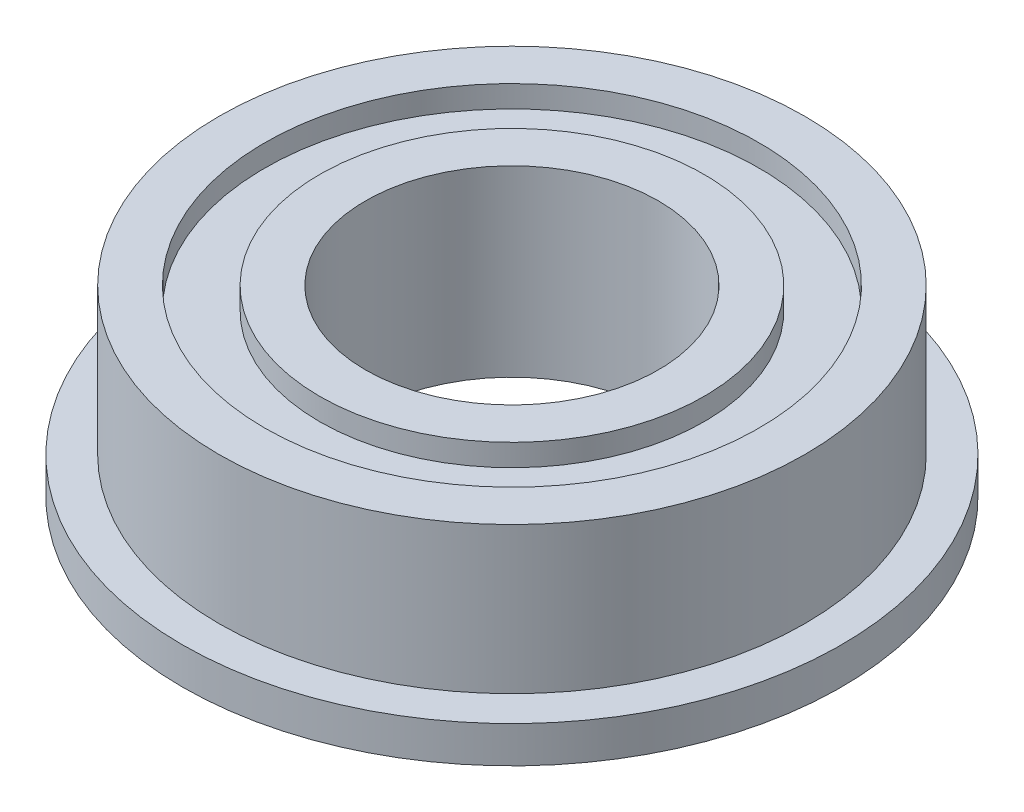
ISO-10303-21;
HEADER;
FILE_DESCRIPTION(('STEP AP214'),'2;1');
FILE_NAME('part.step','',(''),(''),'','','');
FILE_SCHEMA(('AUTOMOTIVE_DESIGN { 1 0 10303 214 1 1 1 1 }'));
ENDSEC;
DATA;
#1=APPLICATION_CONTEXT('core data for automotive mechanical design processes');
#2=APPLICATION_PROTOCOL_DEFINITION('international standard','automotive_design',2000,#1);
#3=PRODUCT_CONTEXT('',#1,'mechanical');
#4=PRODUCT('Part','Part','',(#3));
#5=PRODUCT_RELATED_PRODUCT_CATEGORY('part','',(#4));
#6=PRODUCT_DEFINITION_FORMATION('','',#4);
#7=PRODUCT_DEFINITION_CONTEXT('part definition',#1,'design');
#8=PRODUCT_DEFINITION('design','',#6,#7);
#9=PRODUCT_DEFINITION_SHAPE('','',#8);
#10=(LENGTH_UNIT() NAMED_UNIT(*) SI_UNIT(.MILLI.,.METRE.));
#11=(NAMED_UNIT(*) PLANE_ANGLE_UNIT() SI_UNIT($,.RADIAN.));
#12=(NAMED_UNIT(*) SI_UNIT($,.STERADIAN.) SOLID_ANGLE_UNIT());
#13=UNCERTAINTY_MEASURE_WITH_UNIT(LENGTH_MEASURE(1.E-05),#10,'distance_accuracy_value','');
#14=(GEOMETRIC_REPRESENTATION_CONTEXT(3) GLOBAL_UNCERTAINTY_ASSIGNED_CONTEXT((#13)) GLOBAL_UNIT_ASSIGNED_CONTEXT((#10,
#11,#12)) REPRESENTATION_CONTEXT('',''));
#15=CARTESIAN_POINT('',(0.,0.,0.));
#16=DIRECTION('',(0.,0.,1.));
#17=DIRECTION('',(1.,0.,0.));
#18=AXIS2_PLACEMENT_3D('',#15,#16,#17);
#19=CARTESIAN_POINT('',(0.,0.,0.));
#20=DIRECTION('',(0.,1.,0.));
#21=DIRECTION('',(0.,0.,1.));
#22=AXIS2_PLACEMENT_3D('',#19,#20,#21);
#23=PLANE('',#22);
#24=CARTESIAN_POINT('',(0.,0.,0.));
#25=DIRECTION('',(0.,1.,0.));
#26=DIRECTION('',(0.,0.,1.));
#27=AXIS2_PLACEMENT_3D('',#24,#25,#26);
#28=CIRCLE('',#27,4.);
#29=CARTESIAN_POINT('',(0.,0.,4.));
#30=VERTEX_POINT('',#29);
#31=EDGE_CURVE('E48',#30,#30,#28,.T.);
#32=ORIENTED_EDGE('',*,*,#31,.T.);
#33=EDGE_LOOP('',(#32));
#34=FACE_BOUND('',#33,.T.);
#35=CARTESIAN_POINT('',(0.,0.,0.));
#36=DIRECTION('',(0.,-1.,0.));
#37=DIRECTION('',(0.,0.,-1.));
#38=AXIS2_PLACEMENT_3D('',#35,#36,#37);
#39=CIRCLE('',#38,5.25);
#40=CARTESIAN_POINT('',(0.,0.,-5.25));
#41=VERTEX_POINT('',#40);
#42=EDGE_CURVE('E80',#41,#41,#39,.T.);
#43=ORIENTED_EDGE('',*,*,#42,.T.);
#44=EDGE_LOOP('',(#43));
#45=FACE_BOUND('',#44,.T.);
#46=ADVANCED_FACE('F31',(#34,#45),#23,.F.);
#47=CARTESIAN_POINT('',(0.,5.,0.));
#48=DIRECTION('',(0.,1.,0.));
#49=DIRECTION('',(0.,0.,1.));
#50=AXIS2_PLACEMENT_3D('',#47,#48,#49);
#51=PLANE('',#50);
#52=CARTESIAN_POINT('',(0.,5.,0.));
#53=DIRECTION('',(0.,1.,0.));
#54=DIRECTION('',(0.,0.,1.));
#55=AXIS2_PLACEMENT_3D('',#52,#53,#54);
#56=CIRCLE('',#55,4.);
#57=CARTESIAN_POINT('',(0.,5.,4.));
#58=VERTEX_POINT('',#57);
#59=EDGE_CURVE('E54',#58,#58,#56,.T.);
#60=ORIENTED_EDGE('',*,*,#59,.F.);
#61=EDGE_LOOP('',(#60));
#62=FACE_BOUND('',#61,.T.);
#63=CARTESIAN_POINT('',(0.,5.,0.));
#64=DIRECTION('',(0.,1.,0.));
#65=DIRECTION('',(0.,0.,1.));
#66=AXIS2_PLACEMENT_3D('',#63,#64,#65);
#67=CIRCLE('',#66,5.25);
#68=CARTESIAN_POINT('',(0.,5.,5.25));
#69=VERTEX_POINT('',#68);
#70=EDGE_CURVE('E68',#69,#69,#67,.T.);
#71=ORIENTED_EDGE('',*,*,#70,.T.);
#72=EDGE_LOOP('',(#71));
#73=FACE_BOUND('',#72,.T.);
#74=ADVANCED_FACE('F119',(#62,#73),#51,.T.);
#75=CARTESIAN_POINT('',(0.,1.,0.));
#76=DIRECTION('',(0.,1.,0.));
#77=DIRECTION('',(0.,0.,1.));
#78=AXIS2_PLACEMENT_3D('',#75,#76,#77);
#79=PLANE('',#78);
#80=CARTESIAN_POINT('',(0.,1.,0.));
#81=DIRECTION('',(0.,1.,0.));
#82=DIRECTION('',(0.,0.,1.));
#83=AXIS2_PLACEMENT_3D('',#80,#81,#82);
#84=CIRCLE('',#83,8.);
#85=CARTESIAN_POINT('',(0.,1.,8.));
#86=VERTEX_POINT('',#85);
#87=EDGE_CURVE('E10',#86,#86,#84,.T.);
#88=ORIENTED_EDGE('',*,*,#87,.F.);
#89=EDGE_LOOP('',(#88));
#90=FACE_BOUND('',#89,.T.);
#91=CARTESIAN_POINT('',(0.,1.,0.));
#92=DIRECTION('',(0.,1.,0.));
#93=DIRECTION('',(0.,0.,1.));
#94=AXIS2_PLACEMENT_3D('',#91,#92,#93);
#95=CIRCLE('',#94,9.);
#96=CARTESIAN_POINT('',(0.,1.,9.));
#97=VERTEX_POINT('',#96);
#98=EDGE_CURVE('E39',#97,#97,#95,.T.);
#99=ORIENTED_EDGE('',*,*,#98,.T.);
#100=EDGE_LOOP('',(#99));
#101=FACE_BOUND('',#100,.T.);
#102=ADVANCED_FACE('F105',(#90,#101),#79,.T.);
#103=CARTESIAN_POINT('',(0.,0.,0.));
#104=DIRECTION('',(0.,-1.,0.));
#105=DIRECTION('',(0.,0.,-1.));
#106=AXIS2_PLACEMENT_3D('',#103,#104,#105);
#107=CIRCLE('',#106,6.75);
#108=CARTESIAN_POINT('',(0.,0.,-6.75));
#109=VERTEX_POINT('',#108);
#110=EDGE_CURVE('E74',#109,#109,#107,.T.);
#111=ORIENTED_EDGE('',*,*,#110,.F.);
#112=EDGE_LOOP('',(#111));
#113=FACE_BOUND('',#112,.T.);
#114=CARTESIAN_POINT('',(0.,0.,0.));
#115=DIRECTION('',(0.,1.,0.));
#116=DIRECTION('',(0.,0.,1.));
#117=AXIS2_PLACEMENT_3D('',#114,#115,#116);
#118=CIRCLE('',#117,9.);
#119=CARTESIAN_POINT('',(0.,0.,9.));
#120=VERTEX_POINT('',#119);
#121=EDGE_CURVE('E35',#120,#120,#118,.T.);
#122=ORIENTED_EDGE('',*,*,#121,.F.);
#123=EDGE_LOOP('',(#122));
#124=FACE_BOUND('',#123,.T.);
#125=ADVANCED_FACE('F102',(#113,#124),#23,.F.);
#126=CARTESIAN_POINT('',(0.,1.,0.));
#127=DIRECTION('',(0.,-1.,0.));
#128=DIRECTION('',(0.,0.,-1.));
#129=AXIS2_PLACEMENT_3D('',#126,#127,#128);
#130=CYLINDRICAL_SURFACE('',#129,9.);
#131=ORIENTED_EDGE('',*,*,#98,.F.);
#132=EDGE_LOOP('',(#131));
#133=FACE_BOUND('',#132,.T.);
#134=ORIENTED_EDGE('',*,*,#121,.T.);
#135=EDGE_LOOP('',(#134));
#136=FACE_BOUND('',#135,.T.);
#137=ADVANCED_FACE('F33',(#133,#136),#130,.T.);
#138=CARTESIAN_POINT('',(0.,1.,0.));
#139=DIRECTION('',(0.,-1.,0.));
#140=DIRECTION('',(0.,0.,-1.));
#141=AXIS2_PLACEMENT_3D('',#138,#139,#140);
#142=CYLINDRICAL_SURFACE('',#141,4.);
#143=ORIENTED_EDGE('',*,*,#31,.F.);
#144=EDGE_LOOP('',(#143));
#145=FACE_BOUND('',#144,.T.);
#146=ORIENTED_EDGE('',*,*,#59,.T.);
#147=EDGE_LOOP('',(#146));
#148=FACE_BOUND('',#147,.T.);
#149=ADVANCED_FACE('F109',(#145,#148),#142,.F.);
#150=CARTESIAN_POINT('',(0.,5.,0.));
#151=DIRECTION('',(0.,1.,0.));
#152=DIRECTION('',(0.,0.,1.));
#153=AXIS2_PLACEMENT_3D('',#150,#151,#152);
#154=CIRCLE('',#153,6.75);
#155=CARTESIAN_POINT('',(0.,5.,6.75));
#156=VERTEX_POINT('',#155);
#157=EDGE_CURVE('E62',#156,#156,#154,.T.);
#158=ORIENTED_EDGE('',*,*,#157,.F.);
#159=EDGE_LOOP('',(#158));
#160=FACE_BOUND('',#159,.T.);
#161=CARTESIAN_POINT('',(0.,5.,0.));
#162=DIRECTION('',(0.,1.,0.));
#163=DIRECTION('',(0.,0.,1.));
#164=AXIS2_PLACEMENT_3D('',#161,#162,#163);
#165=CIRCLE('',#164,8.);
#166=CARTESIAN_POINT('',(0.,5.,8.));
#167=VERTEX_POINT('',#166);
#168=EDGE_CURVE('E46',#167,#167,#165,.T.);
#169=ORIENTED_EDGE('',*,*,#168,.T.);
#170=EDGE_LOOP('',(#169));
#171=FACE_BOUND('',#170,.T.);
#172=ADVANCED_FACE('F114',(#160,#171),#51,.T.);
#173=CARTESIAN_POINT('',(0.,5.,0.));
#174=DIRECTION('',(0.,-1.,0.));
#175=DIRECTION('',(0.,0.,-1.));
#176=AXIS2_PLACEMENT_3D('',#173,#174,#175);
#177=CYLINDRICAL_SURFACE('',#176,8.);
#178=ORIENTED_EDGE('',*,*,#168,.F.);
#179=EDGE_LOOP('',(#178));
#180=FACE_BOUND('',#179,.T.);
#181=ORIENTED_EDGE('',*,*,#87,.T.);
#182=EDGE_LOOP('',(#181));
#183=FACE_BOUND('',#182,.T.);
#184=ADVANCED_FACE('F130',(#180,#183),#177,.T.);
#185=CARTESIAN_POINT('',(0.,4.4,0.));
#186=DIRECTION('',(0.,1.,0.));
#187=DIRECTION('',(0.,0.,1.));
#188=AXIS2_PLACEMENT_3D('',#185,#186,#187);
#189=CYLINDRICAL_SURFACE('',#188,6.75);
#190=CARTESIAN_POINT('',(0.,4.4,0.));
#191=DIRECTION('',(0.,1.,0.));
#192=DIRECTION('',(0.,0.,1.));
#193=AXIS2_PLACEMENT_3D('',#190,#191,#192);
#194=CIRCLE('',#193,6.75);
#195=CARTESIAN_POINT('',(0.,4.4,6.75));
#196=VERTEX_POINT('',#195);
#197=EDGE_CURVE('E58',#196,#196,#194,.T.);
#198=ORIENTED_EDGE('',*,*,#197,.F.);
#199=EDGE_LOOP('',(#198));
#200=FACE_BOUND('',#199,.T.);
#201=ORIENTED_EDGE('',*,*,#157,.T.);
#202=EDGE_LOOP('',(#201));
#203=FACE_BOUND('',#202,.T.);
#204=ADVANCED_FACE('F132',(#200,#203),#189,.F.);
#205=CARTESIAN_POINT('',(0.,4.4,0.));
#206=DIRECTION('',(0.,1.,0.));
#207=DIRECTION('',(0.,0.,1.));
#208=AXIS2_PLACEMENT_3D('',#205,#206,#207);
#209=PLANE('',#208);
#210=CARTESIAN_POINT('',(0.,4.4,0.));
#211=DIRECTION('',(0.,1.,0.));
#212=DIRECTION('',(0.,0.,1.));
#213=AXIS2_PLACEMENT_3D('',#210,#211,#212);
#214=CIRCLE('',#213,5.25);
#215=CARTESIAN_POINT('',(0.,4.4,5.25));
#216=VERTEX_POINT('',#215);
#217=EDGE_CURVE('E66',#216,#216,#214,.T.);
#218=ORIENTED_EDGE('',*,*,#217,.F.);
#219=EDGE_LOOP('',(#218));
#220=FACE_BOUND('',#219,.T.);
#221=ORIENTED_EDGE('',*,*,#197,.T.);
#222=EDGE_LOOP('',(#221));
#223=FACE_BOUND('',#222,.T.);
#224=ADVANCED_FACE('F139',(#220,#223),#209,.T.);
#225=CARTESIAN_POINT('',(0.,4.4,0.));
#226=DIRECTION('',(0.,1.,0.));
#227=DIRECTION('',(0.,0.,1.));
#228=AXIS2_PLACEMENT_3D('',#225,#226,#227);
#229=CYLINDRICAL_SURFACE('',#228,5.25);
#230=ORIENTED_EDGE('',*,*,#217,.T.);
#231=EDGE_LOOP('',(#230));
#232=FACE_BOUND('',#231,.T.);
#233=ORIENTED_EDGE('',*,*,#70,.F.);
#234=EDGE_LOOP('',(#233));
#235=FACE_BOUND('',#234,.T.);
#236=ADVANCED_FACE('F98',(#232,#235),#229,.T.);
#237=CARTESIAN_POINT('',(0.,0.6,0.));
#238=DIRECTION('',(0.,-1.,0.));
#239=DIRECTION('',(0.,0.,-1.));
#240=AXIS2_PLACEMENT_3D('',#237,#238,#239);
#241=CYLINDRICAL_SURFACE('',#240,6.75);
#242=CARTESIAN_POINT('',(0.,0.6,0.));
#243=DIRECTION('',(0.,-1.,0.));
#244=DIRECTION('',(0.,0.,-1.));
#245=AXIS2_PLACEMENT_3D('',#242,#243,#244);
#246=CIRCLE('',#245,6.75);
#247=CARTESIAN_POINT('',(0.,0.6,-6.75));
#248=VERTEX_POINT('',#247);
#249=EDGE_CURVE('E71',#248,#248,#246,.T.);
#250=ORIENTED_EDGE('',*,*,#249,.F.);
#251=EDGE_LOOP('',(#250));
#252=FACE_BOUND('',#251,.T.);
#253=ORIENTED_EDGE('',*,*,#110,.T.);
#254=EDGE_LOOP('',(#253));
#255=FACE_BOUND('',#254,.T.);
#256=ADVANCED_FACE('F92',(#252,#255),#241,.F.);
#257=CARTESIAN_POINT('',(0.,0.6,0.));
#258=DIRECTION('',(0.,-1.,0.));
#259=DIRECTION('',(0.,0.,-1.));
#260=AXIS2_PLACEMENT_3D('',#257,#258,#259);
#261=PLANE('',#260);
#262=CARTESIAN_POINT('',(0.,0.6,0.));
#263=DIRECTION('',(0.,-1.,0.));
#264=DIRECTION('',(0.,0.,-1.));
#265=AXIS2_PLACEMENT_3D('',#262,#263,#264);
#266=CIRCLE('',#265,5.25);
#267=CARTESIAN_POINT('',(0.,0.6,-5.25));
#268=VERTEX_POINT('',#267);
#269=EDGE_CURVE('E77',#268,#268,#266,.T.);
#270=ORIENTED_EDGE('',*,*,#269,.F.);
#271=EDGE_LOOP('',(#270));
#272=FACE_BOUND('',#271,.T.);
#273=ORIENTED_EDGE('',*,*,#249,.T.);
#274=EDGE_LOOP('',(#273));
#275=FACE_BOUND('',#274,.T.);
#276=ADVANCED_FACE('F89',(#272,#275),#261,.T.);
#277=CARTESIAN_POINT('',(0.,0.6,0.));
#278=DIRECTION('',(0.,-1.,0.));
#279=DIRECTION('',(0.,0.,-1.));
#280=AXIS2_PLACEMENT_3D('',#277,#278,#279);
#281=CYLINDRICAL_SURFACE('',#280,5.25);
#282=ORIENTED_EDGE('',*,*,#269,.T.);
#283=EDGE_LOOP('',(#282));
#284=FACE_BOUND('',#283,.T.);
#285=ORIENTED_EDGE('',*,*,#42,.F.);
#286=EDGE_LOOP('',(#285));
#287=FACE_BOUND('',#286,.T.);
#288=ADVANCED_FACE('F86',(#284,#287),#281,.T.);
#289=CLOSED_SHELL('',(#46,#74,#102,#125,#137,#149,#172,#184,#204,#224,#236,#256,#276,#288));
#290=MANIFOLD_SOLID_BREP('B2',#289);
#291=ADVANCED_BREP_SHAPE_REPRESENTATION('',(#18,#290),#14);
#292=SHAPE_DEFINITION_REPRESENTATION(#9,#291);
ENDSEC;
END-ISO-10303-21;
